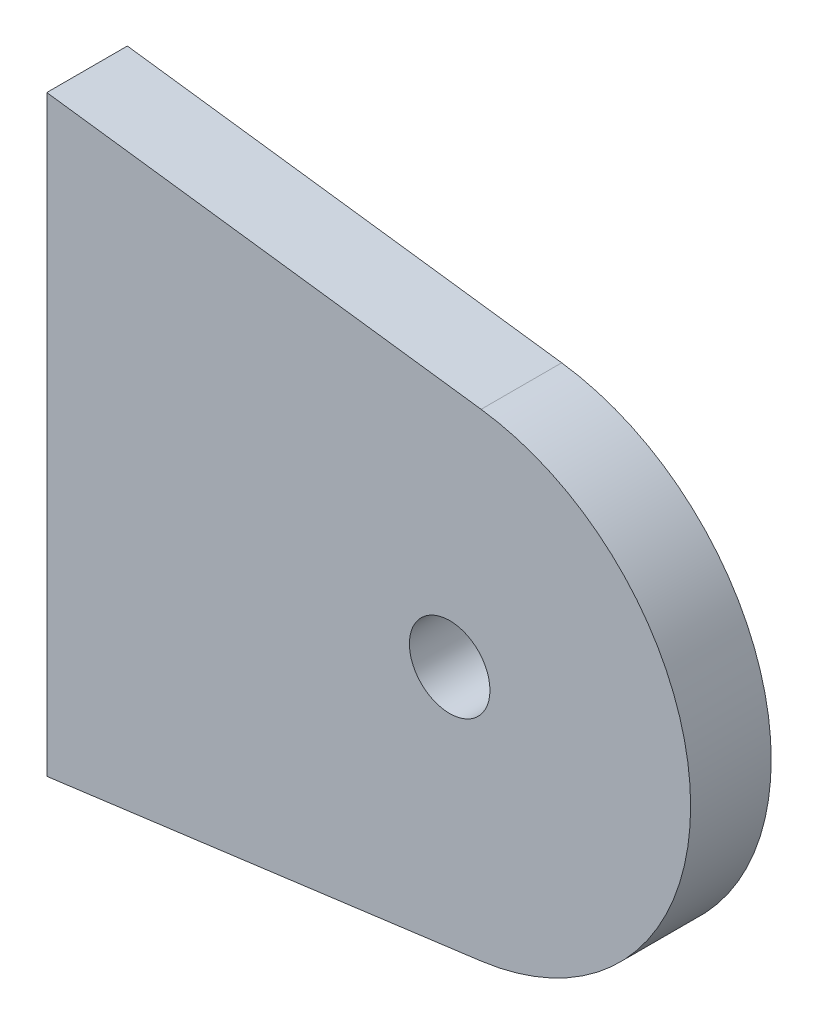
ISO-10303-21;
HEADER;
FILE_DESCRIPTION(('STEP AP214'),'2;1');
FILE_NAME('part.step','',(''),(''),'','','');
FILE_SCHEMA(('AUTOMOTIVE_DESIGN { 1 0 10303 214 1 1 1 1 }'));
ENDSEC;
DATA;
#1=APPLICATION_CONTEXT('core data for automotive mechanical design processes');
#2=APPLICATION_PROTOCOL_DEFINITION('international standard','automotive_design',2000,#1);
#3=PRODUCT_CONTEXT('',#1,'mechanical');
#4=PRODUCT('Part','Part','',(#3));
#5=PRODUCT_RELATED_PRODUCT_CATEGORY('part','',(#4));
#6=PRODUCT_DEFINITION_FORMATION('','',#4);
#7=PRODUCT_DEFINITION_CONTEXT('part definition',#1,'design');
#8=PRODUCT_DEFINITION('design','',#6,#7);
#9=PRODUCT_DEFINITION_SHAPE('','',#8);
#10=(LENGTH_UNIT() NAMED_UNIT(*) SI_UNIT(.MILLI.,.METRE.));
#11=(NAMED_UNIT(*) PLANE_ANGLE_UNIT() SI_UNIT($,.RADIAN.));
#12=(NAMED_UNIT(*) SI_UNIT($,.STERADIAN.) SOLID_ANGLE_UNIT());
#13=UNCERTAINTY_MEASURE_WITH_UNIT(LENGTH_MEASURE(1.E-05),#10,'distance_accuracy_value','');
#14=(GEOMETRIC_REPRESENTATION_CONTEXT(3) GLOBAL_UNCERTAINTY_ASSIGNED_CONTEXT((#13)) GLOBAL_UNIT_ASSIGNED_CONTEXT((#10,
#11,#12)) REPRESENTATION_CONTEXT('',''));
#15=CARTESIAN_POINT('',(0.,0.,0.));
#16=DIRECTION('',(0.,0.,1.));
#17=DIRECTION('',(1.,0.,0.));
#18=AXIS2_PLACEMENT_3D('',#15,#16,#17);
#19=CARTESIAN_POINT('',(1.23946787290706,-9.41469319322447,3.17499999999981));
#20=DIRECTION('',(0.130526192220052,-0.99144486137381,0.));
#21=DIRECTION('',(0.99144486137381,0.130526192220052,0.));
#22=AXIS2_PLACEMENT_3D('',#19,#20,#21);
#23=PLANE('',#22);
#24=DIRECTION('',(-0.99144486137381,-0.130526192220052,0.));
#25=VECTOR('',#24,1.);
#26=CARTESIAN_POINT('',(1.23946787290706,-9.41469319322447,-1.94289029309402E-13));
#27=LINE('',#26,#25);
#28=CARTESIAN_POINT('',(1.23946787290707,-9.41469319322442,-1.94289029309402E-13));
#29=VERTEX_POINT('',#28);
#30=CARTESIAN_POINT('',(-15.8750000000001,-11.667855633572,-1.94289029309402E-13));
#31=VERTEX_POINT('',#30);
#32=EDGE_CURVE('E112',#29,#31,#27,.T.);
#33=ORIENTED_EDGE('',*,*,#32,.F.);
#34=DIRECTION('',(0.,0.,-1.));
#35=VECTOR('',#34,1.);
#36=CARTESIAN_POINT('',(1.23946787290707,-9.41469319322442,3.17499999999981));
#37=LINE('',#36,#35);
#38=CARTESIAN_POINT('',(1.23946787290707,-9.41469319322442,3.17499999999981));
#39=VERTEX_POINT('',#38);
#40=EDGE_CURVE('E11',#39,#29,#37,.T.);
#41=ORIENTED_EDGE('',*,*,#40,.F.);
#42=DIRECTION('',(-0.99144486137381,-0.130526192220052,0.));
#43=VECTOR('',#42,1.);
#44=CARTESIAN_POINT('',(1.23946787290706,-9.41469319322447,3.17499999999981));
#45=LINE('',#44,#43);
#46=CARTESIAN_POINT('',(-15.8750000000001,-11.667855633572,3.17499999999981));
#47=VERTEX_POINT('',#46);
#48=EDGE_CURVE('E94',#39,#47,#45,.T.);
#49=ORIENTED_EDGE('',*,*,#48,.T.);
#50=DIRECTION('',(0.,0.,-1.));
#51=VECTOR('',#50,1.);
#52=CARTESIAN_POINT('',(-15.8750000000001,-11.667855633572,3.17499999999981));
#53=LINE('',#52,#51);
#54=EDGE_CURVE('E61',#47,#31,#53,.T.);
#55=ORIENTED_EDGE('',*,*,#54,.T.);
#56=EDGE_LOOP('',(#33,#41,#49,#55));
#57=FACE_BOUND('',#56,.T.);
#58=ADVANCED_FACE('F45',(#57),#23,.T.);
#59=CARTESIAN_POINT('',(0.,0.,3.17499999999981));
#60=DIRECTION('',(0.,0.,-1.));
#61=DIRECTION('',(-1.,0.,0.));
#62=AXIS2_PLACEMENT_3D('',#59,#60,#61);
#63=CYLINDRICAL_SURFACE('',#62,9.49593220966295);
#64=CARTESIAN_POINT('',(0.,0.,-1.94289029309402E-13));
#65=DIRECTION('',(0.,0.,1.));
#66=DIRECTION('',(1.,0.,0.));
#67=AXIS2_PLACEMENT_3D('',#64,#65,#66);
#68=CIRCLE('',#67,9.49593220966295);
#69=CARTESIAN_POINT('',(1.23946787290707,9.41469319322442,-1.94289029309402E-13));
#70=VERTEX_POINT('',#69);
#71=EDGE_CURVE('E100',#29,#70,#68,.T.);
#72=ORIENTED_EDGE('',*,*,#71,.T.);
#73=DIRECTION('',(0.,0.,-1.));
#74=VECTOR('',#73,1.);
#75=CARTESIAN_POINT('',(1.23946787290707,9.41469319322442,3.17499999999981));
#76=LINE('',#75,#74);
#77=CARTESIAN_POINT('',(1.23946787290707,9.41469319322442,3.17499999999981));
#78=VERTEX_POINT('',#77);
#79=EDGE_CURVE('E53',#78,#70,#76,.T.);
#80=ORIENTED_EDGE('',*,*,#79,.F.);
#81=CARTESIAN_POINT('',(0.,0.,3.17499999999981));
#82=DIRECTION('',(0.,0.,1.));
#83=DIRECTION('',(1.,0.,0.));
#84=AXIS2_PLACEMENT_3D('',#81,#82,#83);
#85=CIRCLE('',#84,9.49593220966295);
#86=EDGE_CURVE('E87',#39,#78,#85,.T.);
#87=ORIENTED_EDGE('',*,*,#86,.F.);
#88=ORIENTED_EDGE('',*,*,#40,.T.);
#89=EDGE_LOOP('',(#72,#80,#87,#88));
#90=FACE_BOUND('',#89,.T.);
#91=ADVANCED_FACE('F98',(#90),#63,.T.);
#92=CARTESIAN_POINT('',(1.23946787290706,9.41469319322445,3.17499999999981));
#93=DIRECTION('',(-0.130526192220053,-0.99144486137381,0.));
#94=DIRECTION('',(0.99144486137381,-0.130526192220053,0.));
#95=AXIS2_PLACEMENT_3D('',#92,#93,#94);
#96=PLANE('',#95);
#97=DIRECTION('',(-0.99144486137381,0.130526192220053,0.));
#98=VECTOR('',#97,1.);
#99=CARTESIAN_POINT('',(1.23946787290706,9.41469319322445,-1.94289029309402E-13));
#100=LINE('',#99,#98);
#101=CARTESIAN_POINT('',(-15.8750000000001,11.6678556335719,-1.94289029309402E-13));
#102=VERTEX_POINT('',#101);
#103=EDGE_CURVE('E115',#70,#102,#100,.T.);
#104=ORIENTED_EDGE('',*,*,#103,.T.);
#105=DIRECTION('',(0.,0.,-1.));
#106=VECTOR('',#105,1.);
#107=CARTESIAN_POINT('',(-15.8750000000001,11.6678556335719,3.17499999999981));
#108=LINE('',#107,#106);
#109=CARTESIAN_POINT('',(-15.8750000000001,11.6678556335719,3.17499999999981));
#110=VERTEX_POINT('',#109);
#111=EDGE_CURVE('E75',#110,#102,#108,.T.);
#112=ORIENTED_EDGE('',*,*,#111,.F.);
#113=DIRECTION('',(-0.99144486137381,0.130526192220053,0.));
#114=VECTOR('',#113,1.);
#115=CARTESIAN_POINT('',(1.23946787290706,9.41469319322445,3.17499999999981));
#116=LINE('',#115,#114);
#117=EDGE_CURVE('E93',#78,#110,#116,.T.);
#118=ORIENTED_EDGE('',*,*,#117,.F.);
#119=ORIENTED_EDGE('',*,*,#79,.T.);
#120=EDGE_LOOP('',(#104,#112,#118,#119));
#121=FACE_BOUND('',#120,.T.);
#122=ADVANCED_FACE('F103',(#121),#96,.F.);
#123=CARTESIAN_POINT('',(-15.8750000000001,0.,3.17499999999981));
#124=DIRECTION('',(-1.,0.,0.));
#125=DIRECTION('',(0.,0.,1.));
#126=AXIS2_PLACEMENT_3D('',#123,#124,#125);
#127=PLANE('',#126);
#128=DIRECTION('',(0.,1.,0.));
#129=VECTOR('',#128,1.);
#130=CARTESIAN_POINT('',(-15.8750000000001,0.,-1.94289029309402E-13));
#131=LINE('',#130,#129);
#132=EDGE_CURVE('E117',#31,#102,#131,.T.);
#133=ORIENTED_EDGE('',*,*,#132,.F.);
#134=ORIENTED_EDGE('',*,*,#54,.F.);
#135=DIRECTION('',(0.,1.,0.));
#136=VECTOR('',#135,1.);
#137=CARTESIAN_POINT('',(-15.8750000000001,0.,3.17499999999981));
#138=LINE('',#137,#136);
#139=EDGE_CURVE('E104',#47,#110,#138,.T.);
#140=ORIENTED_EDGE('',*,*,#139,.T.);
#141=ORIENTED_EDGE('',*,*,#111,.T.);
#142=EDGE_LOOP('',(#133,#134,#140,#141));
#143=FACE_BOUND('',#142,.T.);
#144=ADVANCED_FACE('F126',(#143),#127,.T.);
#145=CARTESIAN_POINT('',(0.,0.,3.17499999999981));
#146=DIRECTION('',(0.,0.,-1.));
#147=DIRECTION('',(-1.,0.,0.));
#148=AXIS2_PLACEMENT_3D('',#145,#146,#147);
#149=CYLINDRICAL_SURFACE('',#148,1.58750000000005);
#150=CARTESIAN_POINT('',(0.,0.,3.17499999999981));
#151=DIRECTION('',(0.,0.,1.));
#152=DIRECTION('',(1.,0.,0.));
#153=AXIS2_PLACEMENT_3D('',#150,#151,#152);
#154=CIRCLE('',#153,1.58750000000005);
#155=CARTESIAN_POINT('',(1.58750000000005,0.,3.17499999999981));
#156=VERTEX_POINT('',#155);
#157=EDGE_CURVE('E106',#156,#156,#154,.T.);
#158=ORIENTED_EDGE('',*,*,#157,.T.);
#159=EDGE_LOOP('',(#158));
#160=FACE_BOUND('',#159,.T.);
#161=CARTESIAN_POINT('',(0.,0.,-1.94289029309402E-13));
#162=DIRECTION('',(0.,0.,1.));
#163=DIRECTION('',(1.,0.,0.));
#164=AXIS2_PLACEMENT_3D('',#161,#162,#163);
#165=CIRCLE('',#164,1.58750000000005);
#166=CARTESIAN_POINT('',(1.58750000000005,0.,-1.94289029309402E-13));
#167=VERTEX_POINT('',#166);
#168=EDGE_CURVE('E120',#167,#167,#165,.T.);
#169=ORIENTED_EDGE('',*,*,#168,.F.);
#170=EDGE_LOOP('',(#169));
#171=FACE_BOUND('',#170,.T.);
#172=ADVANCED_FACE('F128',(#160,#171),#149,.F.);
#173=CARTESIAN_POINT('',(0.,0.,3.17499999999981));
#174=DIRECTION('',(0.,0.,1.));
#175=DIRECTION('',(1.,0.,0.));
#176=AXIS2_PLACEMENT_3D('',#173,#174,#175);
#177=PLANE('',#176);
#178=ORIENTED_EDGE('',*,*,#48,.F.);
#179=ORIENTED_EDGE('',*,*,#86,.T.);
#180=ORIENTED_EDGE('',*,*,#117,.T.);
#181=ORIENTED_EDGE('',*,*,#139,.F.);
#182=EDGE_LOOP('',(#178,#179,#180,#181));
#183=FACE_BOUND('',#182,.T.);
#184=ORIENTED_EDGE('',*,*,#157,.F.);
#185=EDGE_LOOP('',(#184));
#186=FACE_BOUND('',#185,.T.);
#187=ADVANCED_FACE('F89',(#183,#186),#177,.T.);
#188=CARTESIAN_POINT('',(0.,0.,-1.94289029309402E-13));
#189=DIRECTION('',(0.,0.,1.));
#190=DIRECTION('',(1.,0.,0.));
#191=AXIS2_PLACEMENT_3D('',#188,#189,#190);
#192=PLANE('',#191);
#193=ORIENTED_EDGE('',*,*,#32,.T.);
#194=ORIENTED_EDGE('',*,*,#132,.T.);
#195=ORIENTED_EDGE('',*,*,#103,.F.);
#196=ORIENTED_EDGE('',*,*,#71,.F.);
#197=EDGE_LOOP('',(#193,#194,#195,#196));
#198=FACE_BOUND('',#197,.T.);
#199=ORIENTED_EDGE('',*,*,#168,.T.);
#200=EDGE_LOOP('',(#199));
#201=FACE_BOUND('',#200,.T.);
#202=ADVANCED_FACE('F168',(#198,#201),#192,.F.);
#203=CLOSED_SHELL('',(#58,#91,#122,#144,#172,#187,#202));
#204=MANIFOLD_SOLID_BREP('B2',#203);
#205=ADVANCED_BREP_SHAPE_REPRESENTATION('',(#18,#204),#14);
#206=SHAPE_DEFINITION_REPRESENTATION(#9,#205);
ENDSEC;
END-ISO-10303-21;
